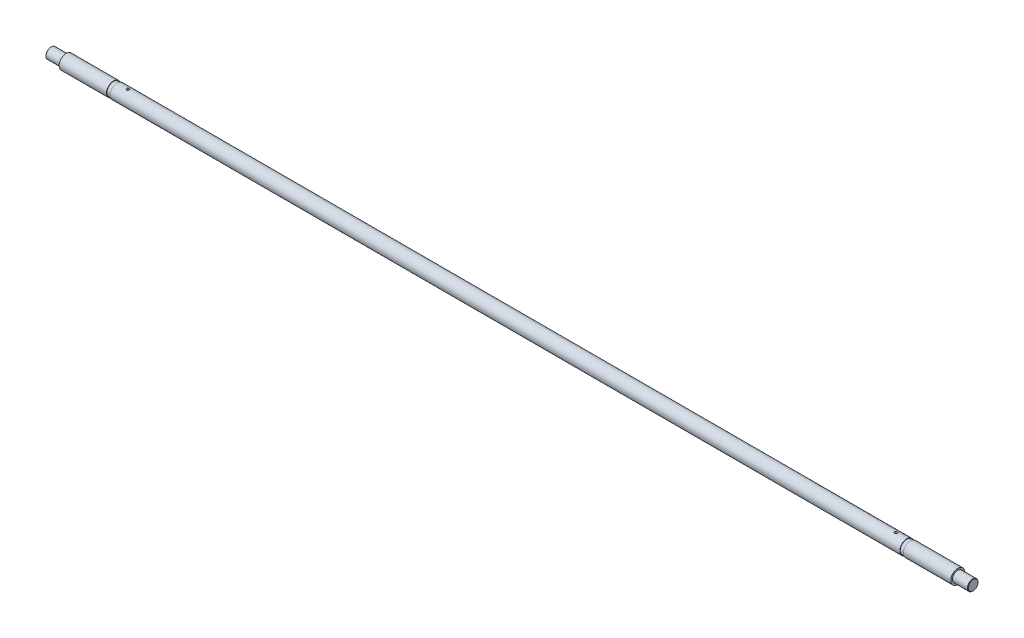
ISO-10303-21;
HEADER;
FILE_DESCRIPTION(('STEP AP214'),'2;1');
FILE_NAME('part.step','',(''),(''),'','','');
FILE_SCHEMA(('AUTOMOTIVE_DESIGN { 1 0 10303 214 1 1 1 1 }'));
ENDSEC;
DATA;
#1=APPLICATION_CONTEXT('core data for automotive mechanical design processes');
#2=APPLICATION_PROTOCOL_DEFINITION('international standard','automotive_design',2000,#1);
#3=PRODUCT_CONTEXT('',#1,'mechanical');
#4=PRODUCT('Part','Part','',(#3));
#5=PRODUCT_RELATED_PRODUCT_CATEGORY('part','',(#4));
#6=PRODUCT_DEFINITION_FORMATION('','',#4);
#7=PRODUCT_DEFINITION_CONTEXT('part definition',#1,'design');
#8=PRODUCT_DEFINITION('design','',#6,#7);
#9=PRODUCT_DEFINITION_SHAPE('','',#8);
#10=(LENGTH_UNIT() NAMED_UNIT(*) SI_UNIT(.MILLI.,.METRE.));
#11=(NAMED_UNIT(*) PLANE_ANGLE_UNIT() SI_UNIT($,.RADIAN.));
#12=(NAMED_UNIT(*) SI_UNIT($,.STERADIAN.) SOLID_ANGLE_UNIT());
#13=UNCERTAINTY_MEASURE_WITH_UNIT(LENGTH_MEASURE(1.E-05),#10,'distance_accuracy_value','');
#14=(GEOMETRIC_REPRESENTATION_CONTEXT(3) GLOBAL_UNCERTAINTY_ASSIGNED_CONTEXT((#13)) GLOBAL_UNIT_ASSIGNED_CONTEXT((#10,
#11,#12)) REPRESENTATION_CONTEXT('',''));
#15=CARTESIAN_POINT('',(0.,0.,0.));
#16=DIRECTION('',(0.,0.,1.));
#17=DIRECTION('',(1.,0.,0.));
#18=AXIS2_PLACEMENT_3D('',#15,#16,#17);
#19=CARTESIAN_POINT('',(800.79215,0.,0.));
#20=DIRECTION('',(-1.,0.,0.));
#21=DIRECTION('',(0.,0.,0.999999999999999));
#22=AXIS2_PLACEMENT_3D('',#19,#20,#21);
#23=CYLINDRICAL_SURFACE('',#22,12.7);
#24=CARTESIAN_POINT('',(689.5973,-12.474760456117,2.38124999999995));
#25=CARTESIAN_POINT('',(689.72978831772,-12.4747630202467,2.38124491814725));
#26=CARTESIAN_POINT('',(689.862342567797,-12.4768940162009,2.37015538078952));
#27=CARTESIAN_POINT('',(690.123713351511,-12.4851771348463,2.32612014537215));
#28=CARTESIAN_POINT('',(690.252526617578,-12.4913326686228,2.29315590657446));
#29=CARTESIAN_POINT('',(690.502595800801,-12.5069437513818,2.20641919043241));
#30=CARTESIAN_POINT('',(690.623858636025,-12.5163962255082,2.1526660965257));
#31=CARTESIAN_POINT('',(690.855637525368,-12.5375324928447,2.02592885644582));
#32=CARTESIAN_POINT('',(690.966154417168,-12.5492161119191,1.95294621092722));
#33=CARTESIAN_POINT('',(691.174687941229,-12.5736606355684,1.78885340321417));
#34=CARTESIAN_POINT('',(691.272551417511,-12.5864321014327,1.69755015031286));
#35=CARTESIAN_POINT('',(691.451665718489,-12.6115200154165,1.49982519885068));
#36=CARTESIAN_POINT('',(691.532915452524,-12.6238364336195,1.39340250850465));
#37=CARTESIAN_POINT('',(691.677082760353,-12.6467396580259,1.1674536826302));
#38=CARTESIAN_POINT('',(691.739855934462,-12.6573125703313,1.04783388355383));
#39=CARTESIAN_POINT('',(691.844357898359,-12.6754192870478,0.799514662160666));
#40=CARTESIAN_POINT('',(691.886088418334,-12.6829533413123,0.670815987327049));
#41=CARTESIAN_POINT('',(691.94684690842,-12.69405886259,0.409579359572612));
#42=CARTESIAN_POINT('',(691.966133060652,-12.6976753598742,0.277103400651301));
#43=CARTESIAN_POINT('',(691.982259809224,-12.7006934932726,0.0107500357062578));
#44=CARTESIAN_POINT('',(691.979102316871,-12.7000954882948,-0.123127250010594));
#45=CARTESIAN_POINT('',(691.950629413304,-12.6947871859914,-0.386712393165212));
#46=CARTESIAN_POINT('',(691.92559200103,-12.6901284844245,-0.516451469716626));
#47=CARTESIAN_POINT('',(691.854509656585,-12.6772801180453,-0.769853625573235));
#48=CARTESIAN_POINT('',(691.808463958814,-12.6690903245507,-0.893516483262051));
#49=CARTESIAN_POINT('',(691.696407226945,-12.6500137572203,-1.13206222938047));
#50=CARTESIAN_POINT('',(691.630285062939,-12.6391120342544,-1.2468916702936));
#51=CARTESIAN_POINT('',(691.48003425034,-12.6158172172427,-1.46392896382817));
#52=CARTESIAN_POINT('',(691.395903770566,-12.6034239715872,-1.56613553122079));
#53=CARTESIAN_POINT('',(691.210492571514,-12.578294529679,-1.75667292011322));
#54=CARTESIAN_POINT('',(691.108968643056,-12.5655559886883,-1.84476692826787));
#55=CARTESIAN_POINT('',(690.892462619095,-12.5413533291784,-2.0027133531386));
#56=CARTESIAN_POINT('',(690.777480326699,-12.529889229309,-2.07256550292988));
#57=CARTESIAN_POINT('',(690.53700749526,-12.5095300562506,-2.19211290406349));
#58=CARTESIAN_POINT('',(690.41149944921,-12.5006393771679,-2.24177373662099));
#59=CARTESIAN_POINT('',(690.153716870204,-12.4865009730475,-2.31923680447896));
#60=CARTESIAN_POINT('',(690.021443105762,-12.4812528352381,-2.34704151655504));
#61=CARTESIAN_POINT('',(689.756019315441,-12.4750753847785,-2.37965730331455));
#62=CARTESIAN_POINT('',(689.62291254154,-12.4740821735812,-2.38480860803796));
#63=CARTESIAN_POINT('',(689.357740765049,-12.4763560388058,-2.37288338099734));
#64=CARTESIAN_POINT('',(689.225675711265,-12.479622904538,-2.3558079484971));
#65=CARTESIAN_POINT('',(688.967454766401,-12.4899893085034,-2.30020603260962));
#66=CARTESIAN_POINT('',(688.841259073958,-12.4970569637177,-2.26185791252082));
#67=CARTESIAN_POINT('',(688.597084211303,-12.5142011297363,-2.16498843701755));
#68=CARTESIAN_POINT('',(688.479105647437,-12.5242778622921,-2.10646559479458));
#69=CARTESIAN_POINT('',(688.253215154769,-12.546450298586,-1.97012485577456));
#70=CARTESIAN_POINT('',(688.145435146138,-12.5585679648769,-1.89209203177897));
#71=CARTESIAN_POINT('',(687.94437588616,-12.5833951304686,-1.71923621646493));
#72=CARTESIAN_POINT('',(687.85109794003,-12.5961046829068,-1.62441171550023));
#73=CARTESIAN_POINT('',(687.68041952539,-12.6208889060944,-1.4191447008693));
#74=CARTESIAN_POINT('',(687.603247875263,-12.6329528238537,-1.3085104228773));
#75=CARTESIAN_POINT('',(687.468587585193,-12.6549055513643,-1.07564955532628));
#76=CARTESIAN_POINT('',(687.41109818746,-12.6647944448513,-0.953423412298704));
#77=CARTESIAN_POINT('',(687.317776844641,-12.6812366706841,-0.70148059725619));
#78=CARTESIAN_POINT('',(687.281832527246,-12.687807281341,-0.571806725762932));
#79=CARTESIAN_POINT('',(687.23226306084,-12.6969463180795,-0.308127760968294));
#80=CARTESIAN_POINT('',(687.218635563373,-12.6995151652753,-0.174123124917716));
#81=CARTESIAN_POINT('',(687.214168333839,-12.7003528618075,0.0922190818976161));
#82=CARTESIAN_POINT('',(687.222983004407,-12.6986869251719,0.224550774967621));
#83=CARTESIAN_POINT('',(687.262392979082,-12.6913777574613,0.485812098730679));
#84=CARTESIAN_POINT('',(687.292988074382,-12.6857345645162,0.614741762026725));
#85=CARTESIAN_POINT('',(687.374944791722,-12.6711049278996,0.865356530007695));
#86=CARTESIAN_POINT('',(687.426269627948,-12.6621244087006,0.98705403191737));
#87=CARTESIAN_POINT('',(687.548187470178,-12.6417922815986,1.22016143971543));
#88=CARTESIAN_POINT('',(687.618781767096,-12.6304405148511,1.33157065569354));
#89=CARTESIAN_POINT('',(687.778424183925,-12.6064133802505,1.54266110659976));
#90=CARTESIAN_POINT('',(687.867721978749,-12.5937213927887,1.6421516486789));
#91=CARTESIAN_POINT('',(688.061718492964,-12.5685491825268,1.82485563504299));
#92=CARTESIAN_POINT('',(688.166420829743,-12.5560690102363,1.90806524541882));
#93=CARTESIAN_POINT('',(688.38941324682,-12.5326072912677,2.05656868887207));
#94=CARTESIAN_POINT('',(688.507820085388,-12.5216406791997,2.12168963089818));
#95=CARTESIAN_POINT('',(688.754060941508,-12.5026274674682,2.23101110217658));
#96=CARTESIAN_POINT('',(688.881885928188,-12.4945781132455,2.27523137850686));
#97=CARTESIAN_POINT('',(689.107956757317,-12.4839891338634,2.33250940972121));
#98=CARTESIAN_POINT('',(689.204879086475,-12.4805489327083,2.35075580362197));
#99=CARTESIAN_POINT('',(689.400288818614,-12.4759336712675,2.37512782333298));
#100=CARTESIAN_POINT('',(689.498776178918,-12.4747585493235,2.38125377907689));
#101=CARTESIAN_POINT('',(689.5973,-12.474760456117,2.38124999999995));
#102=B_SPLINE_CURVE_WITH_KNOTS('',3,(#24,#25,#26,#27,#28,#29,#30,#31,#32,#33,#34,#35,#36,#37,
#38,#39,#40,#41,#42,#43,#44,#45,#46,#47,#48,#49,#50,#51,#52,#53,#54,#55,#56,#57,#58,#59,#60,#61,
#62,#63,#64,#65,#66,#67,#68,#69,#70,#71,#72,#73,#74,#75,#76,#77,#78,#79,#80,#81,#82,#83,#84,#85,
#86,#87,#88,#89,#90,#91,#92,#93,#94,#95,#96,#97,#98,#99,#100,#101),.UNSPECIFIED.,.T.,.F.,(4,2,2,
2,2,2,2,2,2,2,2,2,2,2,2,2,2,2,2,2,2,2,2,2,2,2,2,2,2,2,2,2,2,2,2,2,2,2,4),(0.,0.397104402946759,
0.794545817528802,1.19161754941566,1.58865830340315,1.99012707921664,2.39162220222522,
2.79617653152512,3.20069759179163,3.60051787293148,4.00030410568515,4.39508345325459,
4.78987718883858,5.18689736024933,5.58395792197442,5.98710725937922,6.39026249555408,
6.79410211087726,7.19789595575536,7.59560407131969,7.99329251825194,8.38769582800624,
8.78212821016088,9.18111356963429,9.58013481789019,9.98448799224668,10.3888255967944,
10.7910355270214,11.1932031289686,11.5892151465507,11.9852233676142,12.3805319211692,
12.7758669640439,13.1768606161385,13.5779485827256,13.9827476538749,14.3871635000449,
14.6824748820222,14.9777782251394),.UNSPECIFIED.);
#103=CARTESIAN_POINT('',(689.5973,-12.474760456117,2.38124999999995));
#104=VERTEX_POINT('',#103);
#105=EDGE_CURVE('E55',#104,#104,#102,.T.);
#106=ORIENTED_EDGE('',*,*,#105,.T.);
#107=EDGE_LOOP('',(#106));
#108=FACE_BOUND('',#107,.T.);
#109=CARTESIAN_POINT('',(689.5973,12.474760456117,2.38124999999995));
#110=CARTESIAN_POINT('',(689.46481168228,12.4747630202467,2.38124491814725));
#111=CARTESIAN_POINT('',(689.332257432203,12.4768940162009,2.37015538078952));
#112=CARTESIAN_POINT('',(689.070886648489,12.4851771348463,2.32612014537215));
#113=CARTESIAN_POINT('',(688.942073382422,12.4913326686228,2.29315590657447));
#114=CARTESIAN_POINT('',(688.692004199199,12.5069437513818,2.20641919043242));
#115=CARTESIAN_POINT('',(688.570741363975,12.5163962255082,2.1526660965257));
#116=CARTESIAN_POINT('',(688.338962474632,12.5375324928447,2.02592885644582));
#117=CARTESIAN_POINT('',(688.228445582832,12.5492161119191,1.95294621092722));
#118=CARTESIAN_POINT('',(688.019912058771,12.5736606355684,1.78885340321418));
#119=CARTESIAN_POINT('',(687.922048582489,12.5864321014327,1.69755015031288));
#120=CARTESIAN_POINT('',(687.742934281511,12.6115200154165,1.4998251988507));
#121=CARTESIAN_POINT('',(687.661684547476,12.6238364336195,1.39340250850467));
#122=CARTESIAN_POINT('',(687.517517239647,12.6467396580259,1.16745368263021));
#123=CARTESIAN_POINT('',(687.454744065538,12.6573125703313,1.04783388355384));
#124=CARTESIAN_POINT('',(687.350242101641,12.6754192870478,0.799514662160664));
#125=CARTESIAN_POINT('',(687.308511581666,12.6829533413123,0.670815987327049));
#126=CARTESIAN_POINT('',(687.24775309158,12.69405886259,0.409579359572612));
#127=CARTESIAN_POINT('',(687.228466939348,12.6976753598742,0.277103400651301));
#128=CARTESIAN_POINT('',(687.212340190776,12.7006934932726,0.010750035706257));
#129=CARTESIAN_POINT('',(687.215497683129,12.7000954882948,-0.123127250010595));
#130=CARTESIAN_POINT('',(687.243970586696,12.6947871859915,-0.386712393165213));
#131=CARTESIAN_POINT('',(687.26900799897,12.6901284844245,-0.516451469716627));
#132=CARTESIAN_POINT('',(687.340090343415,12.6772801180453,-0.769853625573235));
#133=CARTESIAN_POINT('',(687.386136041186,12.6690903245507,-0.893516483262051));
#134=CARTESIAN_POINT('',(687.498192773055,12.6500137572202,-1.13206222938047));
#135=CARTESIAN_POINT('',(687.564314937061,12.6391120342544,-1.2468916702936));
#136=CARTESIAN_POINT('',(687.71456574966,12.6158172172427,-1.46392896382817));
#137=CARTESIAN_POINT('',(687.798696229434,12.6034239715872,-1.56613553122079));
#138=CARTESIAN_POINT('',(687.984107428486,12.578294529679,-1.75667292011322));
#139=CARTESIAN_POINT('',(688.085631356944,12.5655559886883,-1.84476692826787));
#140=CARTESIAN_POINT('',(688.302137380905,12.5413533291784,-2.0027133531386));
#141=CARTESIAN_POINT('',(688.417119673301,12.529889229309,-2.07256550292988));
#142=CARTESIAN_POINT('',(688.65759250474,12.5095300562506,-2.19211290406349));
#143=CARTESIAN_POINT('',(688.78310055079,12.5006393771679,-2.24177373662099));
#144=CARTESIAN_POINT('',(689.040883129795,12.4865009730475,-2.31923680447896));
#145=CARTESIAN_POINT('',(689.173156894238,12.4812528352381,-2.34704151655503));
#146=CARTESIAN_POINT('',(689.438580684559,12.4750753847785,-2.37965730331455));
#147=CARTESIAN_POINT('',(689.57168745846,12.4740821735812,-2.38480860803795));
#148=CARTESIAN_POINT('',(689.836859234951,12.4763560388058,-2.37288338099734));
#149=CARTESIAN_POINT('',(689.968924288735,12.4796229045379,-2.3558079484971));
#150=CARTESIAN_POINT('',(690.227145233599,12.4899893085034,-2.30020603260962));
#151=CARTESIAN_POINT('',(690.353340926042,12.4970569637177,-2.26185791252082));
#152=CARTESIAN_POINT('',(690.597515788697,12.5142011297363,-2.16498843701755));
#153=CARTESIAN_POINT('',(690.715494352563,12.5242778622921,-2.10646559479458));
#154=CARTESIAN_POINT('',(690.941384845231,12.546450298586,-1.97012485577456));
#155=CARTESIAN_POINT('',(691.049164853862,12.5585679648769,-1.89209203177897));
#156=CARTESIAN_POINT('',(691.25022411384,12.5833951304686,-1.71923621646493));
#157=CARTESIAN_POINT('',(691.34350205997,12.5961046829068,-1.62441171550023));
#158=CARTESIAN_POINT('',(691.51418047461,12.6208889060944,-1.4191447008693));
#159=CARTESIAN_POINT('',(691.591352124737,12.6329528238537,-1.3085104228773));
#160=CARTESIAN_POINT('',(691.726012414807,12.6549055513643,-1.07564955532628));
#161=CARTESIAN_POINT('',(691.78350181254,12.6647944448513,-0.953423412298704));
#162=CARTESIAN_POINT('',(691.876823155359,12.6812366706841,-0.701480597256189));
#163=CARTESIAN_POINT('',(691.912767472754,12.687807281341,-0.571806725762931));
#164=CARTESIAN_POINT('',(691.96233693916,12.6969463180795,-0.308127760968293));
#165=CARTESIAN_POINT('',(691.975964436627,12.6995151652753,-0.174123124917715));
#166=CARTESIAN_POINT('',(691.98043166616,12.7003528618075,0.0922190818976164));
#167=CARTESIAN_POINT('',(691.971616995593,12.6986869251719,0.224550774967621));
#168=CARTESIAN_POINT('',(691.932207020918,12.6913777574613,0.48581209873068));
#169=CARTESIAN_POINT('',(691.901611925618,12.6857345645162,0.614741762026726));
#170=CARTESIAN_POINT('',(691.819655208278,12.6711049278996,0.865356530007697));
#171=CARTESIAN_POINT('',(691.768330372052,12.6621244087006,0.987054031917372));
#172=CARTESIAN_POINT('',(691.646412529822,12.6417922815986,1.22016143971543));
#173=CARTESIAN_POINT('',(691.575818232904,12.6304405148511,1.33157065569354));
#174=CARTESIAN_POINT('',(691.416175816075,12.6064133802505,1.54266110659976));
#175=CARTESIAN_POINT('',(691.326878021251,12.5937213927887,1.6421516486789));
#176=CARTESIAN_POINT('',(691.132881507036,12.5685491825268,1.82485563504299));
#177=CARTESIAN_POINT('',(691.028179170257,12.5560690102363,1.90806524541882));
#178=CARTESIAN_POINT('',(690.805186753179,12.5326072912677,2.05656868887208));
#179=CARTESIAN_POINT('',(690.686779914612,12.5216406791997,2.12168963089818));
#180=CARTESIAN_POINT('',(690.440539058492,12.5026274674682,2.23101110217658));
#181=CARTESIAN_POINT('',(690.312714071812,12.4945781132455,2.27523137850686));
#182=CARTESIAN_POINT('',(690.086643242683,12.4839891338634,2.33250940972121));
#183=CARTESIAN_POINT('',(689.989720913524,12.4805489327083,2.35075580362197));
#184=CARTESIAN_POINT('',(689.794311181386,12.4759336712675,2.37512782333298));
#185=CARTESIAN_POINT('',(689.695823821082,12.4747585493235,2.38125377907689));
#186=CARTESIAN_POINT('',(689.5973,12.474760456117,2.38124999999995));
#187=B_SPLINE_CURVE_WITH_KNOTS('',3,(#109,#110,#111,#112,#113,#114,#115,#116,#117,#118,#119,
#120,#121,#122,#123,#124,#125,#126,#127,#128,#129,#130,#131,#132,#133,#134,#135,#136,#137,#138,
#139,#140,#141,#142,#143,#144,#145,#146,#147,#148,#149,#150,#151,#152,#153,#154,#155,#156,#157,
#158,#159,#160,#161,#162,#163,#164,#165,#166,#167,#168,#169,#170,#171,#172,#173,#174,#175,#176,
#177,#178,#179,#180,#181,#182,#183,#184,#185,#186),.UNSPECIFIED.,.T.,.F.,(4,2,2,2,2,2,2,2,2,2,2,
2,2,2,2,2,2,2,2,2,2,2,2,2,2,2,2,2,2,2,2,2,2,2,2,2,2,2,4),(0.,0.397104402946759,
0.794545817528801,1.19161754941566,1.58865830340315,1.99012707921652,2.39162220222521,
2.79617653152511,3.20069759179162,3.60051787293148,4.00030410568514,4.39508345325458,
4.78987718883857,5.18689736024933,5.58395792197441,5.98710725937922,6.39026249555408,
6.79410211087726,7.19789595575535,7.59560407131968,7.99329251825193,8.38769582800623,
8.78212821016087,9.18111356963428,9.58013481789018,9.98448799224667,10.3888255967944,
10.7910355270214,11.1932031289686,11.5892151465507,11.9852233676141,12.3805319211692,
12.7758669640439,13.1768606161385,13.5779485827256,13.9827476538749,14.3871635000449,
14.6824748820222,14.9777782251394),.UNSPECIFIED.);
#188=CARTESIAN_POINT('',(689.5973,12.474760456117,2.38124999999995));
#189=VERTEX_POINT('',#188);
#190=EDGE_CURVE('E63',#189,#189,#187,.T.);
#191=ORIENTED_EDGE('',*,*,#190,.T.);
#192=EDGE_LOOP('',(#191));
#193=FACE_BOUND('',#192,.T.);
#194=CARTESIAN_POINT('',(-689.5973,-12.474760456117,2.38124999999995));
#195=CARTESIAN_POINT('',(-689.46481168228,-12.4747630202467,2.38124491814725));
#196=CARTESIAN_POINT('',(-689.332257432203,-12.4768940162009,2.37015538078951));
#197=CARTESIAN_POINT('',(-689.070886648489,-12.4851771348463,2.32612014537215));
#198=CARTESIAN_POINT('',(-688.942073382421,-12.4913326686228,2.29315590657447));
#199=CARTESIAN_POINT('',(-688.692004199199,-12.5069437513818,2.2064191904324));
#200=CARTESIAN_POINT('',(-688.570741363975,-12.5163962255082,2.15266609652566));
#201=CARTESIAN_POINT('',(-688.338962474632,-12.5375324928447,2.02592885644578));
#202=CARTESIAN_POINT('',(-688.228445582832,-12.5492161119191,1.95294621092721));
#203=CARTESIAN_POINT('',(-688.019912058771,-12.5736606355684,1.78885340321419));
#204=CARTESIAN_POINT('',(-687.922048582489,-12.5864321014327,1.69755015031289));
#205=CARTESIAN_POINT('',(-687.742934281511,-12.6115200154165,1.4998251988507));
#206=CARTESIAN_POINT('',(-687.661684547476,-12.6238364336195,1.39340250850467));
#207=CARTESIAN_POINT('',(-687.517517239647,-12.6467396580259,1.16745368263021));
#208=CARTESIAN_POINT('',(-687.454744065538,-12.6573125703313,1.04783388355384));
#209=CARTESIAN_POINT('',(-687.350242101641,-12.6754192870478,0.799514662160664));
#210=CARTESIAN_POINT('',(-687.308511581666,-12.6829533413123,0.670815987327049));
#211=CARTESIAN_POINT('',(-687.24775309158,-12.69405886259,0.409579359572613));
#212=CARTESIAN_POINT('',(-687.228466939348,-12.6976753598742,0.277103400651301));
#213=CARTESIAN_POINT('',(-687.212340190776,-12.7006934932726,0.0107500357062577));
#214=CARTESIAN_POINT('',(-687.215497683129,-12.7000954882948,-0.123127250010594));
#215=CARTESIAN_POINT('',(-687.243970586696,-12.6947871859914,-0.386712393165213));
#216=CARTESIAN_POINT('',(-687.26900799897,-12.6901284844245,-0.516451469716626));
#217=CARTESIAN_POINT('',(-687.340090343415,-12.6772801180453,-0.769853625573235));
#218=CARTESIAN_POINT('',(-687.386136041186,-12.6690903245507,-0.893516483262051));
#219=CARTESIAN_POINT('',(-687.498192773055,-12.6500137572203,-1.13206222938047));
#220=CARTESIAN_POINT('',(-687.564314937061,-12.6391120342544,-1.2468916702936));
#221=CARTESIAN_POINT('',(-687.71456574966,-12.6158172172427,-1.46392896382817));
#222=CARTESIAN_POINT('',(-687.798696229434,-12.6034239715872,-1.56613553122079));
#223=CARTESIAN_POINT('',(-687.984107428486,-12.578294529679,-1.75667292011322));
#224=CARTESIAN_POINT('',(-688.085631356944,-12.5655559886883,-1.84476692826787));
#225=CARTESIAN_POINT('',(-688.302137380905,-12.5413533291784,-2.0027133531386));
#226=CARTESIAN_POINT('',(-688.417119673301,-12.529889229309,-2.07256550292988));
#227=CARTESIAN_POINT('',(-688.65759250474,-12.5095300562506,-2.19211290406349));
#228=CARTESIAN_POINT('',(-688.78310055079,-12.5006393771679,-2.24177373662099));
#229=CARTESIAN_POINT('',(-689.040883129795,-12.4865009730475,-2.31923680447896));
#230=CARTESIAN_POINT('',(-689.173156894238,-12.4812528352381,-2.34704151655504));
#231=CARTESIAN_POINT('',(-689.438580684559,-12.4750753847785,-2.37965730331455));
#232=CARTESIAN_POINT('',(-689.57168745846,-12.4740821735812,-2.38480860803796));
#233=CARTESIAN_POINT('',(-689.836859234951,-12.4763560388058,-2.37288338099734));
#234=CARTESIAN_POINT('',(-689.968924288735,-12.479622904538,-2.3558079484971));
#235=CARTESIAN_POINT('',(-690.227145233599,-12.4899893085034,-2.30020603260962));
#236=CARTESIAN_POINT('',(-690.353340926042,-12.4970569637177,-2.26185791252082));
#237=CARTESIAN_POINT('',(-690.597515788697,-12.5142011297363,-2.16498843701755));
#238=CARTESIAN_POINT('',(-690.715494352563,-12.5242778622921,-2.10646559479458));
#239=CARTESIAN_POINT('',(-690.941384845231,-12.546450298586,-1.97012485577456));
#240=CARTESIAN_POINT('',(-691.049164853862,-12.5585679648769,-1.89209203177897));
#241=CARTESIAN_POINT('',(-691.25022411384,-12.5833951304686,-1.71923621646493));
#242=CARTESIAN_POINT('',(-691.34350205997,-12.5961046829068,-1.62441171550023));
#243=CARTESIAN_POINT('',(-691.51418047461,-12.6208889060944,-1.4191447008693));
#244=CARTESIAN_POINT('',(-691.591352124737,-12.6329528238537,-1.3085104228773));
#245=CARTESIAN_POINT('',(-691.726012414807,-12.6549055513643,-1.07564955532628));
#246=CARTESIAN_POINT('',(-691.78350181254,-12.6647944448513,-0.953423412298705));
#247=CARTESIAN_POINT('',(-691.876823155359,-12.6812366706841,-0.701480597256191));
#248=CARTESIAN_POINT('',(-691.912767472754,-12.687807281341,-0.571806725762933));
#249=CARTESIAN_POINT('',(-691.96233693916,-12.6969463180795,-0.308127760968295));
#250=CARTESIAN_POINT('',(-691.975964436627,-12.6995151652753,-0.174123124917716));
#251=CARTESIAN_POINT('',(-691.98043166616,-12.7003528618075,0.0922190818976162));
#252=CARTESIAN_POINT('',(-691.971616995593,-12.6986869251719,0.224550774967621));
#253=CARTESIAN_POINT('',(-691.932207020918,-12.6913777574613,0.485812098730679));
#254=CARTESIAN_POINT('',(-691.901611925618,-12.6857345645162,0.614741762026725));
#255=CARTESIAN_POINT('',(-691.819655208278,-12.6711049278996,0.865356530007695));
#256=CARTESIAN_POINT('',(-691.768330372052,-12.6621244087006,0.98705403191737));
#257=CARTESIAN_POINT('',(-691.646412529822,-12.6417922815986,1.22016143971543));
#258=CARTESIAN_POINT('',(-691.575818232904,-12.6304405148511,1.33157065569354));
#259=CARTESIAN_POINT('',(-691.416175816075,-12.6064133802505,1.54266110659976));
#260=CARTESIAN_POINT('',(-691.326878021251,-12.5937213927887,1.6421516486789));
#261=CARTESIAN_POINT('',(-691.132881507036,-12.5685491825268,1.82485563504299));
#262=CARTESIAN_POINT('',(-691.028179170257,-12.5560690102363,1.90806524541882));
#263=CARTESIAN_POINT('',(-690.805186753179,-12.5326072912677,2.05656868887207));
#264=CARTESIAN_POINT('',(-690.686779914612,-12.5216406791997,2.12168963089818));
#265=CARTESIAN_POINT('',(-690.440539058492,-12.5026274674682,2.23101110217658));
#266=CARTESIAN_POINT('',(-690.312714071812,-12.4945781132455,2.27523137850686));
#267=CARTESIAN_POINT('',(-690.086643242683,-12.4839891338634,2.33250940972121));
#268=CARTESIAN_POINT('',(-689.989720913524,-12.4805489327083,2.35075580362197));
#269=CARTESIAN_POINT('',(-689.794311181386,-12.4759336712675,2.37512782333298));
#270=CARTESIAN_POINT('',(-689.695823821082,-12.4747585493235,2.38125377907689));
#271=CARTESIAN_POINT('',(-689.5973,-12.474760456117,2.38124999999995));
#272=B_SPLINE_CURVE_WITH_KNOTS('',3,(#194,#195,#196,#197,#198,#199,#200,#201,#202,#203,#204,
#205,#206,#207,#208,#209,#210,#211,#212,#213,#214,#215,#216,#217,#218,#219,#220,#221,#222,#223,
#224,#225,#226,#227,#228,#229,#230,#231,#232,#233,#234,#235,#236,#237,#238,#239,#240,#241,#242,
#243,#244,#245,#246,#247,#248,#249,#250,#251,#252,#253,#254,#255,#256,#257,#258,#259,#260,#261,
#262,#263,#264,#265,#266,#267,#268,#269,#270,#271),.UNSPECIFIED.,.T.,.F.,(4,2,2,2,2,2,2,2,2,2,2,
2,2,2,2,2,2,2,2,2,2,2,2,2,2,2,2,2,2,2,2,2,2,2,2,2,2,2,4),(0.,0.397104402946759,
0.794545817528802,1.19161754941568,1.58865830340315,1.99012707921651,2.39162220222521,
2.7961765315251,3.20069759179162,3.60051787293147,4.00030410568513,4.39508345325458,
4.78987718883857,5.18689736024932,5.5839579219744,5.98710725937921,6.39026249555407,
6.79410211087725,7.19789595575535,7.59560407131968,7.99329251825193,8.38769582800622,
8.78212821016086,9.18111356963428,9.58013481789018,9.98448799224667,10.3888255967944,
10.7910355270214,11.1932031289686,11.5892151465507,11.9852233676141,12.3805319211692,
12.7758669640439,13.1768606161385,13.5779485827256,13.9827476538749,14.3871635000448,
14.6824748820222,14.9777782251394),.UNSPECIFIED.);
#273=CARTESIAN_POINT('',(-689.5973,-12.474760456117,2.38124999999995));
#274=VERTEX_POINT('',#273);
#275=EDGE_CURVE('E89',#274,#274,#272,.T.);
#276=ORIENTED_EDGE('',*,*,#275,.T.);
#277=EDGE_LOOP('',(#276));
#278=FACE_BOUND('',#277,.T.);
#279=CARTESIAN_POINT('',(-689.5973,12.474760456117,2.38124999999995));
#280=CARTESIAN_POINT('',(-689.72978831772,12.4747630202467,2.38124491814725));
#281=CARTESIAN_POINT('',(-689.862342567797,12.4768940162009,2.37015538078951));
#282=CARTESIAN_POINT('',(-690.123713351511,12.4851771348463,2.32612014537215));
#283=CARTESIAN_POINT('',(-690.252526617578,12.4913326686228,2.29315590657448));
#284=CARTESIAN_POINT('',(-690.502595800801,12.5069437513818,2.2064191904324));
#285=CARTESIAN_POINT('',(-690.623858636025,12.5163962255082,2.15266609652566));
#286=CARTESIAN_POINT('',(-690.855637525368,12.5375324928447,2.02592885644578));
#287=CARTESIAN_POINT('',(-690.966154417168,12.5492161119191,1.95294621092721));
#288=CARTESIAN_POINT('',(-691.174687941229,12.5736606355684,1.78885340321419));
#289=CARTESIAN_POINT('',(-691.272551417511,12.5864321014327,1.69755015031289));
#290=CARTESIAN_POINT('',(-691.451665718489,12.6115200154165,1.4998251988507));
#291=CARTESIAN_POINT('',(-691.532915452524,12.6238364336195,1.39340250850467));
#292=CARTESIAN_POINT('',(-691.677082760353,12.6467396580259,1.16745368263021));
#293=CARTESIAN_POINT('',(-691.739855934462,12.6573125703313,1.04783388355384));
#294=CARTESIAN_POINT('',(-691.844357898359,12.6754192870478,0.799514662160663));
#295=CARTESIAN_POINT('',(-691.886088418334,12.6829533413123,0.670815987327049));
#296=CARTESIAN_POINT('',(-691.94684690842,12.69405886259,0.409579359572612));
#297=CARTESIAN_POINT('',(-691.966133060652,12.6976753598742,0.277103400651301));
#298=CARTESIAN_POINT('',(-691.982259809224,12.7006934932726,0.0107500357062569));
#299=CARTESIAN_POINT('',(-691.979102316871,12.7000954882948,-0.123127250010595));
#300=CARTESIAN_POINT('',(-691.950629413304,12.6947871859915,-0.386712393165213));
#301=CARTESIAN_POINT('',(-691.92559200103,12.6901284844245,-0.516451469716626));
#302=CARTESIAN_POINT('',(-691.854509656585,12.6772801180453,-0.769853625573236));
#303=CARTESIAN_POINT('',(-691.808463958814,12.6690903245507,-0.893516483262055));
#304=CARTESIAN_POINT('',(-691.696407226945,12.6500137572202,-1.13206222938045));
#305=CARTESIAN_POINT('',(-691.630285062939,12.6391120342544,-1.24689167029356));
#306=CARTESIAN_POINT('',(-691.48003425034,12.6158172172428,-1.46392896382813));
#307=CARTESIAN_POINT('',(-691.395903770566,12.6034239715872,-1.56613553122078));
#308=CARTESIAN_POINT('',(-691.210492571514,12.578294529679,-1.75667292011323));
#309=CARTESIAN_POINT('',(-691.108968643056,12.5655559886883,-1.84476692826787));
#310=CARTESIAN_POINT('',(-690.892462619095,12.5413533291784,-2.0027133531386));
#311=CARTESIAN_POINT('',(-690.777480326699,12.529889229309,-2.07256550292988));
#312=CARTESIAN_POINT('',(-690.53700749526,12.5095300562506,-2.19211290406349));
#313=CARTESIAN_POINT('',(-690.41149944921,12.5006393771679,-2.24177373662099));
#314=CARTESIAN_POINT('',(-690.153716870204,12.4865009730475,-2.31923680447896));
#315=CARTESIAN_POINT('',(-690.021443105762,12.4812528352381,-2.34704151655503));
#316=CARTESIAN_POINT('',(-689.756019315441,12.4750753847785,-2.37965730331455));
#317=CARTESIAN_POINT('',(-689.62291254154,12.4740821735812,-2.38480860803795));
#318=CARTESIAN_POINT('',(-689.357740765049,12.4763560388058,-2.37288338099734));
#319=CARTESIAN_POINT('',(-689.225675711265,12.4796229045379,-2.3558079484971));
#320=CARTESIAN_POINT('',(-688.967454766401,12.4899893085034,-2.30020603260962));
#321=CARTESIAN_POINT('',(-688.841259073958,12.4970569637177,-2.26185791252082));
#322=CARTESIAN_POINT('',(-688.597084211303,12.5142011297363,-2.16498843701755));
#323=CARTESIAN_POINT('',(-688.479105647437,12.5242778622921,-2.10646559479458));
#324=CARTESIAN_POINT('',(-688.253215154769,12.546450298586,-1.97012485577456));
#325=CARTESIAN_POINT('',(-688.145435146138,12.5585679648769,-1.89209203177897));
#326=CARTESIAN_POINT('',(-687.94437588616,12.5833951304686,-1.71923621646493));
#327=CARTESIAN_POINT('',(-687.85109794003,12.5961046829068,-1.62441171550023));
#328=CARTESIAN_POINT('',(-687.68041952539,12.6208889060944,-1.4191447008693));
#329=CARTESIAN_POINT('',(-687.603247875263,12.6329528238537,-1.3085104228773));
#330=CARTESIAN_POINT('',(-687.468587585193,12.6549055513643,-1.07564955532628));
#331=CARTESIAN_POINT('',(-687.41109818746,12.6647944448513,-0.953423412298704));
#332=CARTESIAN_POINT('',(-687.317776844641,12.6812366706841,-0.701480597256189));
#333=CARTESIAN_POINT('',(-687.281832527246,12.687807281341,-0.571806725762931));
#334=CARTESIAN_POINT('',(-687.23226306084,12.6969463180795,-0.308127760968293));
#335=CARTESIAN_POINT('',(-687.218635563373,12.6995151652753,-0.174123124917715));
#336=CARTESIAN_POINT('',(-687.214168333839,12.7003528618075,0.0922190818976164));
#337=CARTESIAN_POINT('',(-687.222983004407,12.6986869251719,0.224550774967621));
#338=CARTESIAN_POINT('',(-687.262392979082,12.6913777574613,0.48581209873068));
#339=CARTESIAN_POINT('',(-687.292988074382,12.6857345645162,0.614741762026726));
#340=CARTESIAN_POINT('',(-687.374944791722,12.6711049278996,0.865356530007697));
#341=CARTESIAN_POINT('',(-687.426269627948,12.6621244087006,0.987054031917372));
#342=CARTESIAN_POINT('',(-687.548187470178,12.6417922815986,1.22016143971543));
#343=CARTESIAN_POINT('',(-687.618781767096,12.6304405148511,1.33157065569354));
#344=CARTESIAN_POINT('',(-687.778424183925,12.6064133802505,1.54266110659976));
#345=CARTESIAN_POINT('',(-687.867721978749,12.5937213927887,1.6421516486789));
#346=CARTESIAN_POINT('',(-688.061718492964,12.5685491825268,1.82485563504299));
#347=CARTESIAN_POINT('',(-688.166420829743,12.5560690102363,1.90806524541882));
#348=CARTESIAN_POINT('',(-688.38941324682,12.5326072912677,2.05656868887208));
#349=CARTESIAN_POINT('',(-688.507820085388,12.5216406791997,2.12168963089818));
#350=CARTESIAN_POINT('',(-688.754060941508,12.5026274674682,2.23101110217658));
#351=CARTESIAN_POINT('',(-688.881885928188,12.4945781132455,2.27523137850686));
#352=CARTESIAN_POINT('',(-689.107956757317,12.4839891338634,2.33250940972121));
#353=CARTESIAN_POINT('',(-689.204879086475,12.4805489327083,2.35075580362197));
#354=CARTESIAN_POINT('',(-689.400288818614,12.4759336712675,2.37512782333298));
#355=CARTESIAN_POINT('',(-689.498776178918,12.4747585493235,2.38125377907689));
#356=CARTESIAN_POINT('',(-689.5973,12.474760456117,2.38124999999995));
#357=B_SPLINE_CURVE_WITH_KNOTS('',3,(#279,#280,#281,#282,#283,#284,#285,#286,#287,#288,#289,
#290,#291,#292,#293,#294,#295,#296,#297,#298,#299,#300,#301,#302,#303,#304,#305,#306,#307,#308,
#309,#310,#311,#312,#313,#314,#315,#316,#317,#318,#319,#320,#321,#322,#323,#324,#325,#326,#327,
#328,#329,#330,#331,#332,#333,#334,#335,#336,#337,#338,#339,#340,#341,#342,#343,#344,#345,#346,
#347,#348,#349,#350,#351,#352,#353,#354,#355,#356),.UNSPECIFIED.,.T.,.F.,(4,2,2,2,2,2,2,2,2,2,2,
2,2,2,2,2,2,2,2,2,2,2,2,2,2,2,2,2,2,2,2,2,2,2,2,2,2,2,4),(0.,0.397104402946759,
0.794545817528801,1.19161754941568,1.58865830340315,1.99012707921651,2.39162220222521,
2.7961765315251,3.20069759179162,3.60051787293147,4.00030410568513,4.39508345325458,
4.78987718883857,5.18689736024927,5.5839579219744,5.9871072593792,6.39026249555406,
6.79410211087724,7.19789595575534,7.59560407131967,7.99329251825192,8.38769582800621,
8.78212821016085,9.18111356963427,9.58013481789017,9.98448799224666,10.3888255967943,
10.7910355270213,11.1932031289686,11.5892151465507,11.9852233676141,12.3805319211692,
12.7758669640439,13.1768606161385,13.5779485827256,13.9827476538749,14.3871635000448,
14.6824748820222,14.9777782251394),.UNSPECIFIED.);
#358=CARTESIAN_POINT('',(-689.5973,12.474760456117,2.38124999999995));
#359=VERTEX_POINT('',#358);
#360=EDGE_CURVE('E62',#359,#359,#357,.T.);
#361=ORIENTED_EDGE('',*,*,#360,.T.);
#362=EDGE_LOOP('',(#361));
#363=FACE_BOUND('',#362,.T.);
#364=CARTESIAN_POINT('',(709.2315,0.,0.));
#365=DIRECTION('',(1.,0.,0.));
#366=DIRECTION('',(0.,0.,-0.999999999999999));
#367=AXIS2_PLACEMENT_3D('',#364,#365,#366);
#368=CIRCLE('',#367,12.7);
#369=CARTESIAN_POINT('',(709.2315,0.,-12.7));
#370=VERTEX_POINT('',#369);
#371=EDGE_CURVE('E93',#370,#370,#368,.T.);
#372=ORIENTED_EDGE('',*,*,#371,.F.);
#373=EDGE_LOOP('',(#372));
#374=FACE_BOUND('',#373,.T.);
#375=CARTESIAN_POINT('',(-709.2315,0.,0.));
#376=DIRECTION('',(1.,0.,0.));
#377=DIRECTION('',(0.,0.,-0.999999999999999));
#378=AXIS2_PLACEMENT_3D('',#375,#376,#377);
#379=CIRCLE('',#378,12.7);
#380=CARTESIAN_POINT('',(-709.2315,0.,-12.7));
#381=VERTEX_POINT('',#380);
#382=EDGE_CURVE('E111',#381,#381,#379,.T.);
#383=ORIENTED_EDGE('',*,*,#382,.T.);
#384=EDGE_LOOP('',(#383));
#385=FACE_BOUND('',#384,.T.);
#386=ADVANCED_FACE('F34',(#108,#193,#278,#363,#374,#385),#23,.T.);
#387=CARTESIAN_POINT('',(-715.5815,0.,0.));
#388=DIRECTION('',(1.,0.,0.));
#389=DIRECTION('',(0.,0.,-0.999999999999999));
#390=AXIS2_PLACEMENT_3D('',#387,#388,#389);
#391=CIRCLE('',#390,12.7);
#392=CARTESIAN_POINT('',(-715.5815,0.,-12.7));
#393=VERTEX_POINT('',#392);
#394=EDGE_CURVE('E114',#393,#393,#391,.T.);
#395=ORIENTED_EDGE('',*,*,#394,.F.);
#396=EDGE_LOOP('',(#395));
#397=FACE_BOUND('',#396,.T.);
#398=CARTESIAN_POINT('',(-800.79215,0.,0.));
#399=DIRECTION('',(1.,0.,0.));
#400=DIRECTION('',(0.,0.,-0.999999999999999));
#401=AXIS2_PLACEMENT_3D('',#398,#399,#400);
#402=CIRCLE('',#401,12.7);
#403=CARTESIAN_POINT('',(-800.79215,0.,-12.7));
#404=VERTEX_POINT('',#403);
#405=EDGE_CURVE('E129',#404,#404,#402,.T.);
#406=ORIENTED_EDGE('',*,*,#405,.T.);
#407=EDGE_LOOP('',(#406));
#408=FACE_BOUND('',#407,.T.);
#409=ADVANCED_FACE('F105',(#397,#408),#23,.T.);
#410=CARTESIAN_POINT('',(-800.79215,0.,0.));
#411=DIRECTION('',(1.,0.,0.));
#412=DIRECTION('',(0.,0.,-0.999999999999999));
#413=AXIS2_PLACEMENT_3D('',#410,#411,#412);
#414=PLANE('',#413);
#415=ORIENTED_EDGE('',*,*,#405,.F.);
#416=EDGE_LOOP('',(#415));
#417=FACE_BOUND('',#416,.T.);
#418=CARTESIAN_POINT('',(-800.79215,0.,0.));
#419=DIRECTION('',(1.,0.,0.));
#420=DIRECTION('',(0.,0.,-0.999999999999999));
#421=AXIS2_PLACEMENT_3D('',#418,#419,#420);
#422=CIRCLE('',#421,9.5123);
#423=CARTESIAN_POINT('',(-800.79215,0.,-9.51229999999999));
#424=VERTEX_POINT('',#423);
#425=EDGE_CURVE('E54',#424,#424,#422,.F.);
#426=ORIENTED_EDGE('',*,*,#425,.F.);
#427=EDGE_LOOP('',(#426));
#428=FACE_BOUND('',#427,.T.);
#429=ADVANCED_FACE('F139',(#417,#428),#414,.F.);
#430=CARTESIAN_POINT('',(-828.294,0.,0.));
#431=DIRECTION('',(1.,0.,0.));
#432=DIRECTION('',(0.,0.,-0.999999999999999));
#433=AXIS2_PLACEMENT_3D('',#430,#431,#432);
#434=PLANE('',#433);
#435=CARTESIAN_POINT('',(-828.294,0.,0.));
#436=DIRECTION('',(1.,0.,0.));
#437=DIRECTION('',(0.,0.,-0.999999999999999));
#438=AXIS2_PLACEMENT_3D('',#435,#436,#437);
#439=CIRCLE('',#438,8.75029999999977);
#440=CARTESIAN_POINT('',(-828.294,0.,-8.75029999999976));
#441=VERTEX_POINT('',#440);
#442=EDGE_CURVE('E45',#441,#441,#439,.F.);
#443=ORIENTED_EDGE('',*,*,#442,.T.);
#444=EDGE_LOOP('',(#443));
#445=FACE_BOUND('',#444,.T.);
#446=ADVANCED_FACE('F141',(#445),#434,.F.);
#447=CARTESIAN_POINT('',(828.294,0.,0.));
#448=DIRECTION('',(-1.,0.,0.));
#449=DIRECTION('',(0.,0.,0.999999999999999));
#450=AXIS2_PLACEMENT_3D('',#447,#448,#449);
#451=CYLINDRICAL_SURFACE('',#450,9.5123);
#452=CARTESIAN_POINT('',(-827.532,0.,0.));
#453=DIRECTION('',(1.,0.,0.));
#454=DIRECTION('',(0.,0.,-0.999999999999999));
#455=AXIS2_PLACEMENT_3D('',#452,#453,#454);
#456=CIRCLE('',#455,9.5123);
#457=CARTESIAN_POINT('',(-827.532,0.,-9.51229999999999));
#458=VERTEX_POINT('',#457);
#459=EDGE_CURVE('E49',#458,#458,#456,.T.);
#460=ORIENTED_EDGE('',*,*,#459,.T.);
#461=EDGE_LOOP('',(#460));
#462=FACE_BOUND('',#461,.T.);
#463=ORIENTED_EDGE('',*,*,#425,.T.);
#464=EDGE_LOOP('',(#463));
#465=FACE_BOUND('',#464,.T.);
#466=ADVANCED_FACE('F137',(#462,#465),#451,.T.);
#467=CARTESIAN_POINT('',(-715.5815,12.7,0.));
#468=DIRECTION('',(-1.,0.,0.));
#469=DIRECTION('',(0.,0.,0.999999999999999));
#470=AXIS2_PLACEMENT_3D('',#467,#468,#469);
#471=PLANE('',#470);
#472=CARTESIAN_POINT('',(-715.5815,0.,0.));
#473=DIRECTION('',(1.,0.,0.));
#474=DIRECTION('',(0.,0.,-0.999999999999999));
#475=AXIS2_PLACEMENT_3D('',#472,#473,#474);
#476=CIRCLE('',#475,11.90625);
#477=CARTESIAN_POINT('',(-715.5815,0.,-11.90625));
#478=VERTEX_POINT('',#477);
#479=EDGE_CURVE('E117',#478,#478,#476,.T.);
#480=ORIENTED_EDGE('',*,*,#479,.F.);
#481=EDGE_LOOP('',(#480));
#482=FACE_BOUND('',#481,.T.);
#483=ORIENTED_EDGE('',*,*,#394,.T.);
#484=EDGE_LOOP('',(#483));
#485=FACE_BOUND('',#484,.T.);
#486=ADVANCED_FACE('F162',(#482,#485),#471,.F.);
#487=CARTESIAN_POINT('',(800.79215,0.,0.));
#488=DIRECTION('',(1.,0.,0.));
#489=DIRECTION('',(0.,0.,-0.999999999999999));
#490=AXIS2_PLACEMENT_3D('',#487,#488,#489);
#491=CYLINDRICAL_SURFACE('',#490,11.90625);
#492=CARTESIAN_POINT('',(-709.2315,0.,0.));
#493=DIRECTION('',(1.,0.,0.));
#494=DIRECTION('',(0.,0.,-0.999999999999999));
#495=AXIS2_PLACEMENT_3D('',#492,#493,#494);
#496=CIRCLE('',#495,11.90625);
#497=CARTESIAN_POINT('',(-709.2315,0.,-11.90625));
#498=VERTEX_POINT('',#497);
#499=EDGE_CURVE('E113',#498,#498,#496,.T.);
#500=ORIENTED_EDGE('',*,*,#499,.F.);
#501=EDGE_LOOP('',(#500));
#502=FACE_BOUND('',#501,.T.);
#503=ORIENTED_EDGE('',*,*,#479,.T.);
#504=EDGE_LOOP('',(#503));
#505=FACE_BOUND('',#504,.T.);
#506=ADVANCED_FACE('F165',(#502,#505),#491,.T.);
#507=CARTESIAN_POINT('',(-709.2315,12.7,0.));
#508=DIRECTION('',(1.,0.,0.));
#509=DIRECTION('',(0.,0.,-0.999999999999999));
#510=AXIS2_PLACEMENT_3D('',#507,#508,#509);
#511=PLANE('',#510);
#512=ORIENTED_EDGE('',*,*,#382,.F.);
#513=EDGE_LOOP('',(#512));
#514=FACE_BOUND('',#513,.T.);
#515=ORIENTED_EDGE('',*,*,#499,.T.);
#516=EDGE_LOOP('',(#515));
#517=FACE_BOUND('',#516,.T.);
#518=ADVANCED_FACE('F169',(#514,#517),#511,.F.);
#519=CARTESIAN_POINT('',(709.2315,12.7,0.));
#520=DIRECTION('',(-1.,0.,0.));
#521=DIRECTION('',(0.,0.,0.999999999999999));
#522=AXIS2_PLACEMENT_3D('',#519,#520,#521);
#523=PLANE('',#522);
#524=CARTESIAN_POINT('',(709.2315,0.,0.));
#525=DIRECTION('',(1.,0.,0.));
#526=DIRECTION('',(0.,0.,-0.999999999999999));
#527=AXIS2_PLACEMENT_3D('',#524,#525,#526);
#528=CIRCLE('',#527,11.90625);
#529=CARTESIAN_POINT('',(709.2315,0.,-11.90625));
#530=VERTEX_POINT('',#529);
#531=EDGE_CURVE('E120',#530,#530,#528,.T.);
#532=ORIENTED_EDGE('',*,*,#531,.F.);
#533=EDGE_LOOP('',(#532));
#534=FACE_BOUND('',#533,.T.);
#535=ORIENTED_EDGE('',*,*,#371,.T.);
#536=EDGE_LOOP('',(#535));
#537=FACE_BOUND('',#536,.T.);
#538=ADVANCED_FACE('F173',(#534,#537),#523,.F.);
#539=CARTESIAN_POINT('',(800.79215,0.,0.));
#540=DIRECTION('',(1.,0.,0.));
#541=DIRECTION('',(0.,0.,-0.999999999999999));
#542=AXIS2_PLACEMENT_3D('',#539,#540,#541);
#543=CYLINDRICAL_SURFACE('',#542,11.90625);
#544=CARTESIAN_POINT('',(715.5815,0.,0.));
#545=DIRECTION('',(1.,0.,0.));
#546=DIRECTION('',(0.,0.,-0.999999999999999));
#547=AXIS2_PLACEMENT_3D('',#544,#545,#546);
#548=CIRCLE('',#547,11.90625);
#549=CARTESIAN_POINT('',(715.5815,0.,-11.90625));
#550=VERTEX_POINT('',#549);
#551=EDGE_CURVE('E186',#550,#550,#548,.T.);
#552=ORIENTED_EDGE('',*,*,#551,.F.);
#553=EDGE_LOOP('',(#552));
#554=FACE_BOUND('',#553,.T.);
#555=ORIENTED_EDGE('',*,*,#531,.T.);
#556=EDGE_LOOP('',(#555));
#557=FACE_BOUND('',#556,.T.);
#558=ADVANCED_FACE('F175',(#554,#557),#543,.T.);
#559=CARTESIAN_POINT('',(715.5815,12.7,0.));
#560=DIRECTION('',(1.,0.,0.));
#561=DIRECTION('',(0.,0.,-0.999999999999999));
#562=AXIS2_PLACEMENT_3D('',#559,#560,#561);
#563=PLANE('',#562);
#564=CARTESIAN_POINT('',(715.5815,0.,0.));
#565=DIRECTION('',(1.,0.,0.));
#566=DIRECTION('',(0.,0.,-0.999999999999999));
#567=AXIS2_PLACEMENT_3D('',#564,#565,#566);
#568=CIRCLE('',#567,12.7);
#569=CARTESIAN_POINT('',(715.5815,0.,-12.7));
#570=VERTEX_POINT('',#569);
#571=EDGE_CURVE('E97',#570,#570,#568,.T.);
#572=ORIENTED_EDGE('',*,*,#571,.F.);
#573=EDGE_LOOP('',(#572));
#574=FACE_BOUND('',#573,.T.);
#575=ORIENTED_EDGE('',*,*,#551,.T.);
#576=EDGE_LOOP('',(#575));
#577=FACE_BOUND('',#576,.T.);
#578=ADVANCED_FACE('F82',(#574,#577),#563,.F.);
#579=CARTESIAN_POINT('',(828.294,0.,0.));
#580=DIRECTION('',(1.,0.,0.));
#581=DIRECTION('',(0.,0.,-0.999999999999999));
#582=AXIS2_PLACEMENT_3D('',#579,#580,#581);
#583=PLANE('',#582);
#584=CARTESIAN_POINT('',(828.294,0.,0.));
#585=DIRECTION('',(1.,0.,0.));
#586=DIRECTION('',(0.,0.,-0.999999999999999));
#587=AXIS2_PLACEMENT_3D('',#584,#585,#586);
#588=CIRCLE('',#587,8.75030000000021);
#589=CARTESIAN_POINT('',(828.294,0.,-8.75030000000021));
#590=VERTEX_POINT('',#589);
#591=EDGE_CURVE('E41',#590,#590,#588,.T.);
#592=ORIENTED_EDGE('',*,*,#591,.T.);
#593=EDGE_LOOP('',(#592));
#594=FACE_BOUND('',#593,.T.);
#595=ADVANCED_FACE('F158',(#594),#583,.T.);
#596=CARTESIAN_POINT('',(827.532,0.,0.));
#597=DIRECTION('',(1.,0.,0.));
#598=DIRECTION('',(0.,0.,-0.999999999999999));
#599=AXIS2_PLACEMENT_3D('',#596,#597,#598);
#600=CIRCLE('',#599,9.5123);
#601=CARTESIAN_POINT('',(827.532,0.,-9.51229999999999));
#602=VERTEX_POINT('',#601);
#603=EDGE_CURVE('E10',#602,#602,#600,.F.);
#604=ORIENTED_EDGE('',*,*,#603,.T.);
#605=EDGE_LOOP('',(#604));
#606=FACE_BOUND('',#605,.T.);
#607=CARTESIAN_POINT('',(800.79215,0.,0.));
#608=DIRECTION('',(1.,0.,0.));
#609=DIRECTION('',(0.,0.,-0.999999999999999));
#610=AXIS2_PLACEMENT_3D('',#607,#608,#609);
#611=CIRCLE('',#610,9.5123);
#612=CARTESIAN_POINT('',(800.79215,0.,-9.51229999999999));
#613=VERTEX_POINT('',#612);
#614=EDGE_CURVE('E126',#613,#613,#611,.F.);
#615=ORIENTED_EDGE('',*,*,#614,.F.);
#616=EDGE_LOOP('',(#615));
#617=FACE_BOUND('',#616,.T.);
#618=ADVANCED_FACE('F155',(#606,#617),#451,.T.);
#619=CARTESIAN_POINT('',(800.79215,0.,0.));
#620=DIRECTION('',(1.,0.,0.));
#621=DIRECTION('',(0.,0.,-0.999999999999999));
#622=AXIS2_PLACEMENT_3D('',#619,#620,#621);
#623=PLANE('',#622);
#624=CARTESIAN_POINT('',(800.79215,0.,0.));
#625=DIRECTION('',(1.,0.,0.));
#626=DIRECTION('',(0.,0.,-0.999999999999999));
#627=AXIS2_PLACEMENT_3D('',#624,#625,#626);
#628=CIRCLE('',#627,12.7);
#629=CARTESIAN_POINT('',(800.79215,0.,-12.7));
#630=VERTEX_POINT('',#629);
#631=EDGE_CURVE('E130',#630,#630,#628,.T.);
#632=ORIENTED_EDGE('',*,*,#631,.T.);
#633=EDGE_LOOP('',(#632));
#634=FACE_BOUND('',#633,.T.);
#635=ORIENTED_EDGE('',*,*,#614,.T.);
#636=EDGE_LOOP('',(#635));
#637=FACE_BOUND('',#636,.T.);
#638=ADVANCED_FACE('F152',(#634,#637),#623,.T.);
#639=ORIENTED_EDGE('',*,*,#571,.T.);
#640=EDGE_LOOP('',(#639));
#641=FACE_BOUND('',#640,.T.);
#642=ORIENTED_EDGE('',*,*,#631,.F.);
#643=EDGE_LOOP('',(#642));
#644=FACE_BOUND('',#643,.T.);
#645=ADVANCED_FACE('F67',(#641,#644),#23,.T.);
#646=CARTESIAN_POINT('',(-689.5973,-19.05,0.));
#647=DIRECTION('',(0.,0.999999999999999,0.));
#648=DIRECTION('',(0.,0.,0.999999999999999));
#649=AXIS2_PLACEMENT_3D('',#646,#647,#648);
#650=CYLINDRICAL_SURFACE('',#649,2.38124999999995);
#651=ORIENTED_EDGE('',*,*,#360,.F.);
#652=EDGE_LOOP('',(#651));
#653=FACE_BOUND('',#652,.T.);
#654=ORIENTED_EDGE('',*,*,#275,.F.);
#655=EDGE_LOOP('',(#654));
#656=FACE_BOUND('',#655,.T.);
#657=ADVANCED_FACE('F75',(#653,#656),#650,.F.);
#658=CARTESIAN_POINT('',(689.5973,-19.05,0.));
#659=DIRECTION('',(0.,0.999999999999999,0.));
#660=DIRECTION('',(0.,0.,0.999999999999999));
#661=AXIS2_PLACEMENT_3D('',#658,#659,#660);
#662=CYLINDRICAL_SURFACE('',#661,2.38124999999995);
#663=ORIENTED_EDGE('',*,*,#190,.F.);
#664=EDGE_LOOP('',(#663));
#665=FACE_BOUND('',#664,.T.);
#666=ORIENTED_EDGE('',*,*,#105,.F.);
#667=EDGE_LOOP('',(#666));
#668=FACE_BOUND('',#667,.T.);
#669=ADVANCED_FACE('F70',(#665,#668),#662,.F.);
#670=CARTESIAN_POINT('',(-827.532,0.,0.));
#671=DIRECTION('',(1.,0.,0.));
#672=DIRECTION('',(0.,0.,-0.999999999999999));
#673=AXIS2_PLACEMENT_3D('',#670,#671,#672);
#674=CONICAL_SURFACE('',#673,9.5123,0.785398163397502);
#675=ORIENTED_EDGE('',*,*,#442,.F.);
#676=EDGE_LOOP('',(#675));
#677=FACE_BOUND('',#676,.T.);
#678=ORIENTED_EDGE('',*,*,#459,.F.);
#679=EDGE_LOOP('',(#678));
#680=FACE_BOUND('',#679,.T.);
#681=ADVANCED_FACE('F74',(#677,#680),#674,.T.);
#682=CARTESIAN_POINT('',(828.294,0.,0.));
#683=DIRECTION('',(-1.,0.,0.));
#684=DIRECTION('',(0.,0.,0.999999999999999));
#685=AXIS2_PLACEMENT_3D('',#682,#683,#684);
#686=CONICAL_SURFACE('',#685,8.75030000000021,0.785398163397429);
#687=ORIENTED_EDGE('',*,*,#603,.F.);
#688=EDGE_LOOP('',(#687));
#689=FACE_BOUND('',#688,.T.);
#690=ORIENTED_EDGE('',*,*,#591,.F.);
#691=EDGE_LOOP('',(#690));
#692=FACE_BOUND('',#691,.T.);
#693=ADVANCED_FACE('F36',(#689,#692),#686,.T.);
#694=CLOSED_SHELL('',(#386,#409,#429,#446,#466,#486,#506,#518,#538,#558,#578,#595,#618,#638,
#645,#657,#669,#681,#693));
#695=MANIFOLD_SOLID_BREP('B2',#694);
#696=ADVANCED_BREP_SHAPE_REPRESENTATION('',(#18,#695),#14);
#697=SHAPE_DEFINITION_REPRESENTATION(#9,#696);
ENDSEC;
END-ISO-10303-21;
